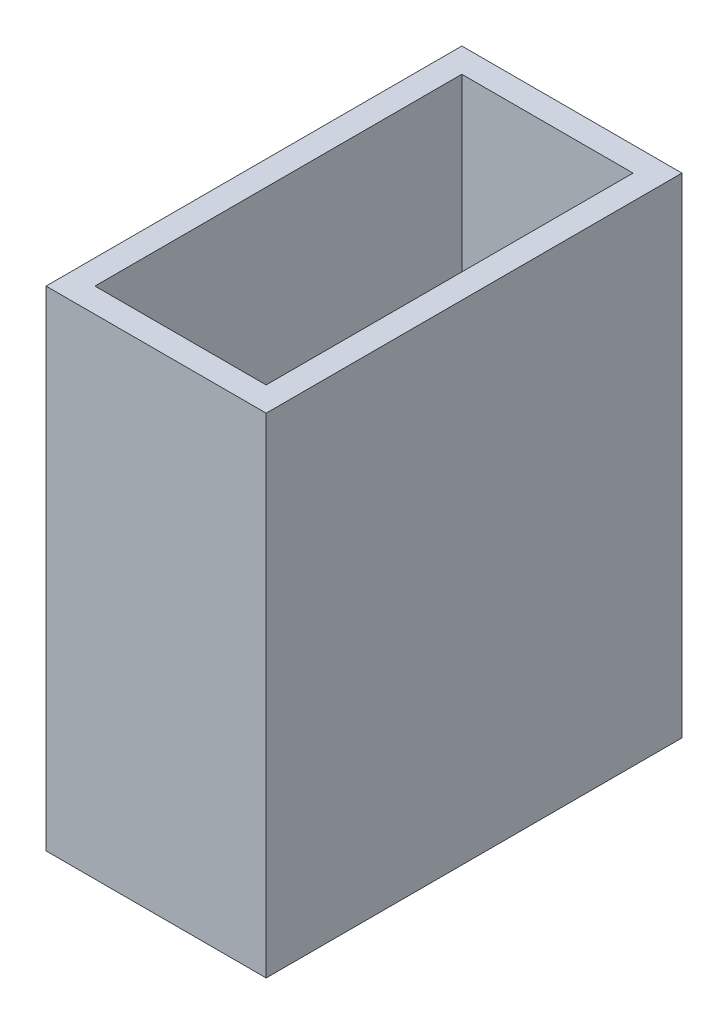
ISO-10303-21;
HEADER;
FILE_DESCRIPTION(('STEP AP214'),'2;1');
FILE_NAME('part.step','',(''),(''),'','','');
FILE_SCHEMA(('AUTOMOTIVE_DESIGN { 1 0 10303 214 1 1 1 1 }'));
ENDSEC;
DATA;
#1=APPLICATION_CONTEXT('core data for automotive mechanical design processes');
#2=APPLICATION_PROTOCOL_DEFINITION('international standard','automotive_design',2000,#1);
#3=PRODUCT_CONTEXT('',#1,'mechanical');
#4=PRODUCT('Part','Part','',(#3));
#5=PRODUCT_RELATED_PRODUCT_CATEGORY('part','',(#4));
#6=PRODUCT_DEFINITION_FORMATION('','',#4);
#7=PRODUCT_DEFINITION_CONTEXT('part definition',#1,'design');
#8=PRODUCT_DEFINITION('design','',#6,#7);
#9=PRODUCT_DEFINITION_SHAPE('','',#8);
#10=(LENGTH_UNIT() NAMED_UNIT(*) SI_UNIT(.MILLI.,.METRE.));
#11=(NAMED_UNIT(*) PLANE_ANGLE_UNIT() SI_UNIT($,.RADIAN.));
#12=(NAMED_UNIT(*) SI_UNIT($,.STERADIAN.) SOLID_ANGLE_UNIT());
#13=UNCERTAINTY_MEASURE_WITH_UNIT(LENGTH_MEASURE(1.E-05),#10,'distance_accuracy_value','');
#14=(GEOMETRIC_REPRESENTATION_CONTEXT(3) GLOBAL_UNCERTAINTY_ASSIGNED_CONTEXT((#13)) GLOBAL_UNIT_ASSIGNED_CONTEXT((#10,
#11,#12)) REPRESENTATION_CONTEXT('',''));
#15=CARTESIAN_POINT('',(0.,0.,0.));
#16=DIRECTION('',(0.,0.,1.));
#17=DIRECTION('',(1.,0.,0.));
#18=AXIS2_PLACEMENT_3D('',#15,#16,#17);
#19=CARTESIAN_POINT('',(0.,20.,0.));
#20=DIRECTION('',(0.,-1.,0.));
#21=DIRECTION('',(0.,0.,-1.));
#22=AXIS2_PLACEMENT_3D('',#19,#20,#21);
#23=CYLINDRICAL_SURFACE('',#22,13.25);
#24=DIRECTION('',(0.,-1.,0.));
#25=VECTOR('',#24,1.);
#26=CARTESIAN_POINT('',(3.4293523476084,20.,-12.7985171983302));
#27=LINE('',#26,#25);
#28=CARTESIAN_POINT('',(3.4293523476084,11.,-12.7985171983302));
#29=VERTEX_POINT('',#28);
#30=CARTESIAN_POINT('',(3.4293523476084,5.,-12.7985171983302));
#31=VERTEX_POINT('',#30);
#32=EDGE_CURVE('E230',#29,#31,#27,.T.);
#33=ORIENTED_EDGE('',*,*,#32,.F.);
#34=CARTESIAN_POINT('',(0.,11.,0.));
#35=DIRECTION('',(0.,1.,0.));
#36=DIRECTION('',(0.,0.,1.));
#37=AXIS2_PLACEMENT_3D('',#34,#35,#36);
#38=CIRCLE('',#37,13.25);
#39=CARTESIAN_POINT('',(-3.42935234760831,11.,-12.7985171983302));
#40=VERTEX_POINT('',#39);
#41=EDGE_CURVE('E220',#29,#40,#38,.T.);
#42=ORIENTED_EDGE('',*,*,#41,.T.);
#43=DIRECTION('',(0.,-1.,0.));
#44=VECTOR('',#43,1.);
#45=CARTESIAN_POINT('',(-3.42935234760831,20.,-12.7985171983302));
#46=LINE('',#45,#44);
#47=CARTESIAN_POINT('',(-3.42935234760831,5.,-12.7985171983302));
#48=VERTEX_POINT('',#47);
#49=EDGE_CURVE('E228',#40,#48,#46,.T.);
#50=ORIENTED_EDGE('',*,*,#49,.T.);
#51=CARTESIAN_POINT('',(0.,5.,0.));
#52=DIRECTION('',(0.,1.,0.));
#53=DIRECTION('',(0.,0.,1.));
#54=AXIS2_PLACEMENT_3D('',#51,#52,#53);
#55=CIRCLE('',#54,13.25);
#56=EDGE_CURVE('E407',#31,#48,#55,.T.);
#57=ORIENTED_EDGE('',*,*,#56,.F.);
#58=EDGE_LOOP('',(#33,#42,#50,#57));
#59=FACE_BOUND('',#58,.T.);
#60=ADVANCED_FACE('F41',(#59),#23,.F.);
#61=CARTESIAN_POINT('',(0.,20.,0.));
#62=DIRECTION('',(-0.965925826289068,0.,-0.258819045102521));
#63=DIRECTION('',(-0.258819045102521,0.,0.965925826289068));
#64=AXIS2_PLACEMENT_3D('',#61,#62,#63);
#65=PLANE('',#64);
#66=DIRECTION('',(0.258819045102521,0.,-0.965925826289068));
#67=VECTOR('',#66,1.);
#68=CARTESIAN_POINT('',(0.,11.,0.));
#69=LINE('',#68,#67);
#70=CARTESIAN_POINT('',(4.20580948291597,11.,-15.6962946771974));
#71=VERTEX_POINT('',#70);
#72=EDGE_CURVE('E233',#29,#71,#69,.T.);
#73=ORIENTED_EDGE('',*,*,#72,.F.);
#74=ORIENTED_EDGE('',*,*,#32,.T.);
#75=DIRECTION('',(0.258819045102521,0.,-0.965925826289068));
#76=VECTOR('',#75,1.);
#77=CARTESIAN_POINT('',(0.,5.,0.));
#78=LINE('',#77,#76);
#79=CARTESIAN_POINT('',(4.20580948291597,5.,-15.6962946771974));
#80=VERTEX_POINT('',#79);
#81=EDGE_CURVE('E480',#31,#80,#78,.T.);
#82=ORIENTED_EDGE('',*,*,#81,.T.);
#83=DIRECTION('',(0.,-1.,0.));
#84=VECTOR('',#83,1.);
#85=CARTESIAN_POINT('',(4.20580948291597,20.,-15.6962946771974));
#86=LINE('',#85,#84);
#87=EDGE_CURVE('E244',#71,#80,#86,.T.);
#88=ORIENTED_EDGE('',*,*,#87,.F.);
#89=EDGE_LOOP('',(#73,#74,#82,#88));
#90=FACE_BOUND('',#89,.T.);
#91=ADVANCED_FACE('F369',(#90),#65,.F.);
#92=CARTESIAN_POINT('',(0.,20.,0.));
#93=DIRECTION('',(0.,-1.,0.));
#94=DIRECTION('',(0.,0.,-1.));
#95=AXIS2_PLACEMENT_3D('',#92,#93,#94);
#96=CYLINDRICAL_SURFACE('',#95,16.25);
#97=CARTESIAN_POINT('',(0.,11.,0.));
#98=DIRECTION('',(0.,1.,0.));
#99=DIRECTION('',(0.,0.,1.));
#100=AXIS2_PLACEMENT_3D('',#97,#98,#99);
#101=CIRCLE('',#100,16.25);
#102=CARTESIAN_POINT('',(-4.20580948291586,11.,-15.6962946771974));
#103=VERTEX_POINT('',#102);
#104=EDGE_CURVE('E56',#71,#103,#101,.T.);
#105=ORIENTED_EDGE('',*,*,#104,.F.);
#106=ORIENTED_EDGE('',*,*,#87,.T.);
#107=CARTESIAN_POINT('',(0.,5.,0.));
#108=DIRECTION('',(0.,1.,0.));
#109=DIRECTION('',(0.,0.,1.));
#110=AXIS2_PLACEMENT_3D('',#107,#108,#109);
#111=CIRCLE('',#110,16.25);
#112=CARTESIAN_POINT('',(-4.20580948291586,5.,-15.6962946771974));
#113=VERTEX_POINT('',#112);
#114=EDGE_CURVE('E246',#80,#113,#111,.T.);
#115=ORIENTED_EDGE('',*,*,#114,.T.);
#116=DIRECTION('',(0.,-1.,0.));
#117=VECTOR('',#116,1.);
#118=CARTESIAN_POINT('',(-4.20580948291586,20.,-15.6962946771974));
#119=LINE('',#118,#117);
#120=EDGE_CURVE('E240',#103,#113,#119,.T.);
#121=ORIENTED_EDGE('',*,*,#120,.F.);
#122=EDGE_LOOP('',(#105,#106,#115,#121));
#123=FACE_BOUND('',#122,.T.);
#124=ADVANCED_FACE('F374',(#123),#96,.T.);
#125=CARTESIAN_POINT('',(0.,20.,0.));
#126=DIRECTION('',(0.96592582628907,0.,-0.258819045102514));
#127=DIRECTION('',(-0.258819045102514,0.,-0.96592582628907));
#128=AXIS2_PLACEMENT_3D('',#125,#126,#127);
#129=PLANE('',#128);
#130=DIRECTION('',(0.258819045102514,0.,0.96592582628907));
#131=VECTOR('',#130,1.);
#132=CARTESIAN_POINT('',(0.,11.,0.));
#133=LINE('',#132,#131);
#134=EDGE_CURVE('E11',#103,#40,#133,.T.);
#135=ORIENTED_EDGE('',*,*,#134,.F.);
#136=ORIENTED_EDGE('',*,*,#120,.T.);
#137=DIRECTION('',(0.258819045102514,0.,0.96592582628907));
#138=VECTOR('',#137,1.);
#139=CARTESIAN_POINT('',(0.,5.,0.));
#140=LINE('',#139,#138);
#141=EDGE_CURVE('E237',#113,#48,#140,.T.);
#142=ORIENTED_EDGE('',*,*,#141,.T.);
#143=ORIENTED_EDGE('',*,*,#49,.F.);
#144=EDGE_LOOP('',(#135,#136,#142,#143));
#145=FACE_BOUND('',#144,.T.);
#146=ADVANCED_FACE('F235',(#145),#129,.F.);
#147=CARTESIAN_POINT('',(0.,20.,29.));
#148=DIRECTION('',(0.,0.,-1.));
#149=DIRECTION('',(-1.,0.,0.));
#150=AXIS2_PLACEMENT_3D('',#147,#148,#149);
#151=PLANE('',#150);
#152=DIRECTION('',(-1.,0.,0.));
#153=VECTOR('',#152,1.);
#154=CARTESIAN_POINT('',(-12.25,17.5,29.));
#155=LINE('',#154,#153);
#156=CARTESIAN_POINT('',(-2.25,17.5,29.));
#157=VERTEX_POINT('',#156);
#158=CARTESIAN_POINT('',(-13.25,17.5,29.));
#159=VERTEX_POINT('',#158);
#160=EDGE_CURVE('E64',#157,#159,#155,.T.);
#161=ORIENTED_EDGE('',*,*,#160,.F.);
#162=DIRECTION('',(0.,-1.,0.));
#163=VECTOR('',#162,1.);
#164=CARTESIAN_POINT('',(-2.25,17.5,29.));
#165=LINE('',#164,#163);
#166=CARTESIAN_POINT('',(-2.25,18.,29.));
#167=VERTEX_POINT('',#166);
#168=EDGE_CURVE('E232',#167,#157,#165,.T.);
#169=ORIENTED_EDGE('',*,*,#168,.F.);
#170=DIRECTION('',(1.,0.,0.));
#171=VECTOR('',#170,1.);
#172=CARTESIAN_POINT('',(-2.25,18.,29.));
#173=LINE('',#172,#171);
#174=CARTESIAN_POINT('',(-1.25,18.,29.));
#175=VERTEX_POINT('',#174);
#176=EDGE_CURVE('E535',#167,#175,#173,.T.);
#177=ORIENTED_EDGE('',*,*,#176,.T.);
#178=DIRECTION('',(0.,-1.,0.));
#179=VECTOR('',#178,1.);
#180=CARTESIAN_POINT('',(-1.25,20.,29.));
#181=LINE('',#180,#179);
#182=CARTESIAN_POINT('',(-1.25,5.,29.));
#183=VERTEX_POINT('',#182);
#184=EDGE_CURVE('E467',#175,#183,#181,.T.);
#185=ORIENTED_EDGE('',*,*,#184,.T.);
#186=DIRECTION('',(1.,0.,0.));
#187=VECTOR('',#186,1.);
#188=CARTESIAN_POINT('',(0.,5.,29.));
#189=LINE('',#188,#187);
#190=CARTESIAN_POINT('',(-13.25,5.,29.));
#191=VERTEX_POINT('',#190);
#192=EDGE_CURVE('E427',#191,#183,#189,.T.);
#193=ORIENTED_EDGE('',*,*,#192,.F.);
#194=DIRECTION('',(0.,-1.,0.));
#195=VECTOR('',#194,1.);
#196=CARTESIAN_POINT('',(-13.25,20.,29.));
#197=LINE('',#196,#195);
#198=EDGE_CURVE('E464',#159,#191,#197,.T.);
#199=ORIENTED_EDGE('',*,*,#198,.F.);
#200=EDGE_LOOP('',(#161,#169,#177,#185,#193,#199));
#201=FACE_BOUND('',#200,.T.);
#202=ADVANCED_FACE('F628',(#201),#151,.T.);
#203=CARTESIAN_POINT('',(-1.25,20.,0.));
#204=DIRECTION('',(-1.,0.,0.));
#205=DIRECTION('',(0.,0.,1.));
#206=AXIS2_PLACEMENT_3D('',#203,#204,#205);
#207=PLANE('',#206);
#208=ORIENTED_EDGE('',*,*,#184,.F.);
#209=DIRECTION('',(0.,0.,1.));
#210=VECTOR('',#209,1.);
#211=CARTESIAN_POINT('',(-1.25,18.,13.1909059582729));
#212=LINE('',#211,#210);
#213=CARTESIAN_POINT('',(-1.25,18.,13.1909059582729));
#214=VERTEX_POINT('',#213);
#215=EDGE_CURVE('E516',#214,#175,#212,.T.);
#216=ORIENTED_EDGE('',*,*,#215,.F.);
#217=DIRECTION('',(0.,-1.,0.));
#218=VECTOR('',#217,1.);
#219=CARTESIAN_POINT('',(-1.25,20.,13.1909059582729));
#220=LINE('',#219,#218);
#221=CARTESIAN_POINT('',(-1.25,5.,13.1909059582729));
#222=VERTEX_POINT('',#221);
#223=EDGE_CURVE('E470',#214,#222,#220,.T.);
#224=ORIENTED_EDGE('',*,*,#223,.T.);
#225=DIRECTION('',(0.,0.,-1.));
#226=VECTOR('',#225,1.);
#227=CARTESIAN_POINT('',(-1.25,5.,0.));
#228=LINE('',#227,#226);
#229=EDGE_CURVE('E420',#183,#222,#228,.T.);
#230=ORIENTED_EDGE('',*,*,#229,.F.);
#231=EDGE_LOOP('',(#208,#216,#224,#230));
#232=FACE_BOUND('',#231,.T.);
#233=ADVANCED_FACE('F402',(#232),#207,.T.);
#234=CARTESIAN_POINT('',(-13.25,20.,0.));
#235=DIRECTION('',(1.,0.,0.));
#236=DIRECTION('',(0.,0.,-1.));
#237=AXIS2_PLACEMENT_3D('',#234,#235,#236);
#238=PLANE('',#237);
#239=DIRECTION('',(0.,1.,0.));
#240=VECTOR('',#239,1.);
#241=CARTESIAN_POINT('',(-13.25,20.,9.));
#242=LINE('',#241,#240);
#243=CARTESIAN_POINT('',(-13.25,17.5,9.));
#244=VERTEX_POINT('',#243);
#245=CARTESIAN_POINT('',(-13.25,20.,9.));
#246=VERTEX_POINT('',#245);
#247=EDGE_CURVE('E547',#244,#246,#242,.T.);
#248=ORIENTED_EDGE('',*,*,#247,.F.);
#249=DIRECTION('',(0.,0.,-1.));
#250=VECTOR('',#249,1.);
#251=CARTESIAN_POINT('',(-13.25,17.5,29.));
#252=LINE('',#251,#250);
#253=EDGE_CURVE('E542',#159,#244,#252,.T.);
#254=ORIENTED_EDGE('',*,*,#253,.F.);
#255=ORIENTED_EDGE('',*,*,#198,.T.);
#256=DIRECTION('',(0.,0.,1.));
#257=VECTOR('',#256,1.);
#258=CARTESIAN_POINT('',(-13.25,5.,0.));
#259=LINE('',#258,#257);
#260=CARTESIAN_POINT('',(-13.25,5.,0.));
#261=VERTEX_POINT('',#260);
#262=EDGE_CURVE('E434',#261,#191,#259,.T.);
#263=ORIENTED_EDGE('',*,*,#262,.F.);
#264=DIRECTION('',(0.,-1.,0.));
#265=VECTOR('',#264,1.);
#266=CARTESIAN_POINT('',(-13.25,20.,0.));
#267=LINE('',#266,#265);
#268=CARTESIAN_POINT('',(-13.25,20.,0.));
#269=VERTEX_POINT('',#268);
#270=EDGE_CURVE('E461',#269,#261,#267,.T.);
#271=ORIENTED_EDGE('',*,*,#270,.F.);
#272=DIRECTION('',(0.,0.,1.));
#273=VECTOR('',#272,1.);
#274=CARTESIAN_POINT('',(-13.25,20.,0.));
#275=LINE('',#274,#273);
#276=EDGE_CURVE('E575',#269,#246,#275,.T.);
#277=ORIENTED_EDGE('',*,*,#276,.T.);
#278=EDGE_LOOP('',(#248,#254,#255,#263,#271,#277));
#279=FACE_BOUND('',#278,.T.);
#280=ADVANCED_FACE('F396',(#279),#238,.T.);
#281=CARTESIAN_POINT('',(0.,5.,0.));
#282=DIRECTION('',(0.,1.,0.));
#283=DIRECTION('',(0.,0.,1.));
#284=AXIS2_PLACEMENT_3D('',#281,#282,#283);
#285=PLANE('',#284);
#286=ORIENTED_EDGE('',*,*,#56,.T.);
#287=ORIENTED_EDGE('',*,*,#141,.F.);
#288=ORIENTED_EDGE('',*,*,#114,.F.);
#289=ORIENTED_EDGE('',*,*,#81,.F.);
#290=EDGE_LOOP('',(#286,#287,#288,#289));
#291=FACE_BOUND('',#290,.T.);
#292=DIRECTION('',(0.,0.,-1.));
#293=VECTOR('',#292,1.);
#294=CARTESIAN_POINT('',(17.5,5.,-42.5));
#295=LINE('',#294,#293);
#296=CARTESIAN_POINT('',(17.5,5.,37.5));
#297=VERTEX_POINT('',#296);
#298=CARTESIAN_POINT('',(17.5,5.,-37.5));
#299=VERTEX_POINT('',#298);
#300=EDGE_CURVE('E254',#297,#299,#295,.T.);
#301=ORIENTED_EDGE('',*,*,#300,.T.);
#302=DIRECTION('',(-1.,0.,0.));
#303=VECTOR('',#302,1.);
#304=CARTESIAN_POINT('',(-22.5,5.,-37.5));
#305=LINE('',#304,#303);
#306=CARTESIAN_POINT('',(-17.5,5.,-37.5));
#307=VERTEX_POINT('',#306);
#308=EDGE_CURVE('E258',#299,#307,#305,.T.);
#309=ORIENTED_EDGE('',*,*,#308,.T.);
#310=DIRECTION('',(0.,0.,1.));
#311=VECTOR('',#310,1.);
#312=CARTESIAN_POINT('',(-17.5,5.,-42.5));
#313=LINE('',#312,#311);
#314=CARTESIAN_POINT('',(-17.5,5.,37.5));
#315=VERTEX_POINT('',#314);
#316=EDGE_CURVE('E273',#307,#315,#313,.T.);
#317=ORIENTED_EDGE('',*,*,#316,.T.);
#318=DIRECTION('',(1.,0.,0.));
#319=VECTOR('',#318,1.);
#320=CARTESIAN_POINT('',(-22.5,5.,37.5));
#321=LINE('',#320,#319);
#322=EDGE_CURVE('E279',#315,#297,#321,.T.);
#323=ORIENTED_EDGE('',*,*,#322,.T.);
#324=EDGE_LOOP('',(#301,#309,#317,#323));
#325=FACE_BOUND('',#324,.T.);
#326=CARTESIAN_POINT('',(0.,5.,0.));
#327=DIRECTION('',(0.,1.,0.));
#328=DIRECTION('',(0.,0.,1.));
#329=AXIS2_PLACEMENT_3D('',#326,#327,#328);
#330=CIRCLE('',#329,13.25);
#331=CARTESIAN_POINT('',(1.75,5.,13.1339255365637));
#332=VERTEX_POINT('',#331);
#333=EDGE_CURVE('E414',#222,#332,#330,.T.);
#334=ORIENTED_EDGE('',*,*,#333,.T.);
#335=DIRECTION('',(0.,0.,-1.));
#336=VECTOR('',#335,1.);
#337=CARTESIAN_POINT('',(1.75,5.,0.));
#338=LINE('',#337,#336);
#339=CARTESIAN_POINT('',(1.75,5.,32.));
#340=VERTEX_POINT('',#339);
#341=EDGE_CURVE('E417',#340,#332,#338,.T.);
#342=ORIENTED_EDGE('',*,*,#341,.F.);
#343=DIRECTION('',(1.,0.,0.));
#344=VECTOR('',#343,1.);
#345=CARTESIAN_POINT('',(0.,5.,32.));
#346=LINE('',#345,#344);
#347=CARTESIAN_POINT('',(-16.25,5.,32.));
#348=VERTEX_POINT('',#347);
#349=EDGE_CURVE('E445',#348,#340,#346,.T.);
#350=ORIENTED_EDGE('',*,*,#349,.F.);
#351=DIRECTION('',(0.,0.,1.));
#352=VECTOR('',#351,1.);
#353=CARTESIAN_POINT('',(-16.25,5.,0.));
#354=LINE('',#353,#352);
#355=CARTESIAN_POINT('',(-16.25,5.,0.));
#356=VERTEX_POINT('',#355);
#357=EDGE_CURVE('E441',#356,#348,#354,.T.);
#358=ORIENTED_EDGE('',*,*,#357,.F.);
#359=DIRECTION('',(-1.,0.,0.));
#360=VECTOR('',#359,1.);
#361=CARTESIAN_POINT('',(0.,5.,0.));
#362=LINE('',#361,#360);
#363=EDGE_CURVE('E438',#261,#356,#362,.T.);
#364=ORIENTED_EDGE('',*,*,#363,.F.);
#365=ORIENTED_EDGE('',*,*,#262,.T.);
#366=ORIENTED_EDGE('',*,*,#192,.T.);
#367=ORIENTED_EDGE('',*,*,#229,.T.);
#368=EDGE_LOOP('',(#334,#342,#350,#358,#364,#365,#366,#367));
#369=FACE_BOUND('',#368,.T.);
#370=ADVANCED_FACE('F394',(#291,#325,#369),#285,.T.);
#371=CARTESIAN_POINT('',(22.5,100.,-42.5));
#372=DIRECTION('',(-1.,0.,0.));
#373=DIRECTION('',(0.,0.,1.));
#374=AXIS2_PLACEMENT_3D('',#371,#372,#373);
#375=PLANE('',#374);
#376=DIRECTION('',(0.,0.,-1.));
#377=VECTOR('',#376,1.);
#378=CARTESIAN_POINT('',(22.5,0.,-42.5));
#379=LINE('',#378,#377);
#380=CARTESIAN_POINT('',(22.5,0.,42.5));
#381=VERTEX_POINT('',#380);
#382=CARTESIAN_POINT('',(22.5,0.,-42.5));
#383=VERTEX_POINT('',#382);
#384=EDGE_CURVE('E263',#381,#383,#379,.T.);
#385=ORIENTED_EDGE('',*,*,#384,.T.);
#386=DIRECTION('',(0.,-1.,0.));
#387=VECTOR('',#386,1.);
#388=CARTESIAN_POINT('',(22.5,100.,-42.5));
#389=LINE('',#388,#387);
#390=CARTESIAN_POINT('',(22.5,100.,-42.5));
#391=VERTEX_POINT('',#390);
#392=EDGE_CURVE('E50',#391,#383,#389,.T.);
#393=ORIENTED_EDGE('',*,*,#392,.F.);
#394=DIRECTION('',(0.,0.,-1.));
#395=VECTOR('',#394,1.);
#396=CARTESIAN_POINT('',(22.5,100.,-42.5));
#397=LINE('',#396,#395);
#398=CARTESIAN_POINT('',(22.5,100.,42.5));
#399=VERTEX_POINT('',#398);
#400=EDGE_CURVE('E297',#399,#391,#397,.T.);
#401=ORIENTED_EDGE('',*,*,#400,.F.);
#402=DIRECTION('',(0.,-1.,0.));
#403=VECTOR('',#402,1.);
#404=CARTESIAN_POINT('',(22.5,100.,42.5));
#405=LINE('',#404,#403);
#406=EDGE_CURVE('E311',#399,#381,#405,.T.);
#407=ORIENTED_EDGE('',*,*,#406,.T.);
#408=EDGE_LOOP('',(#385,#393,#401,#407));
#409=FACE_BOUND('',#408,.T.);
#410=ADVANCED_FACE('F43',(#409),#375,.F.);
#411=CARTESIAN_POINT('',(-22.5,100.,-42.5));
#412=DIRECTION('',(0.,0.,1.));
#413=DIRECTION('',(1.,0.,0.));
#414=AXIS2_PLACEMENT_3D('',#411,#412,#413);
#415=PLANE('',#414);
#416=DIRECTION('',(-1.,0.,0.));
#417=VECTOR('',#416,1.);
#418=CARTESIAN_POINT('',(-22.5,0.,-42.5));
#419=LINE('',#418,#417);
#420=CARTESIAN_POINT('',(-22.5,0.,-42.5));
#421=VERTEX_POINT('',#420);
#422=EDGE_CURVE('E315',#383,#421,#419,.T.);
#423=ORIENTED_EDGE('',*,*,#422,.T.);
#424=DIRECTION('',(0.,-1.,0.));
#425=VECTOR('',#424,1.);
#426=CARTESIAN_POINT('',(-22.5,100.,-42.5));
#427=LINE('',#426,#425);
#428=CARTESIAN_POINT('',(-22.5,100.,-42.5));
#429=VERTEX_POINT('',#428);
#430=EDGE_CURVE('E330',#429,#421,#427,.T.);
#431=ORIENTED_EDGE('',*,*,#430,.F.);
#432=DIRECTION('',(-1.,0.,0.));
#433=VECTOR('',#432,1.);
#434=CARTESIAN_POINT('',(-22.5,100.,-42.5));
#435=LINE('',#434,#433);
#436=EDGE_CURVE('E301',#391,#429,#435,.T.);
#437=ORIENTED_EDGE('',*,*,#436,.F.);
#438=ORIENTED_EDGE('',*,*,#392,.T.);
#439=EDGE_LOOP('',(#423,#431,#437,#438));
#440=FACE_BOUND('',#439,.T.);
#441=ADVANCED_FACE('F337',(#440),#415,.F.);
#442=CARTESIAN_POINT('',(-22.5,100.,-42.5));
#443=DIRECTION('',(1.,0.,0.));
#444=DIRECTION('',(0.,0.,-1.));
#445=AXIS2_PLACEMENT_3D('',#442,#443,#444);
#446=PLANE('',#445);
#447=DIRECTION('',(0.,0.,1.));
#448=VECTOR('',#447,1.);
#449=CARTESIAN_POINT('',(-22.5,0.,-42.5));
#450=LINE('',#449,#448);
#451=CARTESIAN_POINT('',(-22.5,0.,42.5));
#452=VERTEX_POINT('',#451);
#453=EDGE_CURVE('E318',#421,#452,#450,.T.);
#454=ORIENTED_EDGE('',*,*,#453,.T.);
#455=DIRECTION('',(0.,-1.,0.));
#456=VECTOR('',#455,1.);
#457=CARTESIAN_POINT('',(-22.5,100.,42.5));
#458=LINE('',#457,#456);
#459=CARTESIAN_POINT('',(-22.5,100.,42.5));
#460=VERTEX_POINT('',#459);
#461=EDGE_CURVE('E326',#460,#452,#458,.T.);
#462=ORIENTED_EDGE('',*,*,#461,.F.);
#463=DIRECTION('',(0.,0.,1.));
#464=VECTOR('',#463,1.);
#465=CARTESIAN_POINT('',(-22.5,100.,-42.5));
#466=LINE('',#465,#464);
#467=EDGE_CURVE('E305',#429,#460,#466,.T.);
#468=ORIENTED_EDGE('',*,*,#467,.F.);
#469=ORIENTED_EDGE('',*,*,#430,.T.);
#470=EDGE_LOOP('',(#454,#462,#468,#469));
#471=FACE_BOUND('',#470,.T.);
#472=ADVANCED_FACE('F349',(#471),#446,.F.);
#473=CARTESIAN_POINT('',(-22.5,100.,42.5));
#474=DIRECTION('',(0.,0.,-1.));
#475=DIRECTION('',(-1.,0.,0.));
#476=AXIS2_PLACEMENT_3D('',#473,#474,#475);
#477=PLANE('',#476);
#478=DIRECTION('',(1.,0.,0.));
#479=VECTOR('',#478,1.);
#480=CARTESIAN_POINT('',(-22.5,0.,42.5));
#481=LINE('',#480,#479);
#482=EDGE_CURVE('E302',#452,#381,#481,.T.);
#483=ORIENTED_EDGE('',*,*,#482,.T.);
#484=ORIENTED_EDGE('',*,*,#406,.F.);
#485=DIRECTION('',(1.,0.,0.));
#486=VECTOR('',#485,1.);
#487=CARTESIAN_POINT('',(-22.5,100.,42.5));
#488=LINE('',#487,#486);
#489=EDGE_CURVE('E308',#460,#399,#488,.T.);
#490=ORIENTED_EDGE('',*,*,#489,.F.);
#491=ORIENTED_EDGE('',*,*,#461,.T.);
#492=EDGE_LOOP('',(#483,#484,#490,#491));
#493=FACE_BOUND('',#492,.T.);
#494=ADVANCED_FACE('F353',(#493),#477,.F.);
#495=CARTESIAN_POINT('',(0.,100.,0.));
#496=DIRECTION('',(0.,1.,0.));
#497=DIRECTION('',(0.,0.,1.));
#498=AXIS2_PLACEMENT_3D('',#495,#496,#497);
#499=PLANE('',#498);
#500=DIRECTION('',(0.,0.,-1.));
#501=VECTOR('',#500,1.);
#502=CARTESIAN_POINT('',(17.5,100.,-42.5));
#503=LINE('',#502,#501);
#504=CARTESIAN_POINT('',(17.5,100.,37.5));
#505=VERTEX_POINT('',#504);
#506=CARTESIAN_POINT('',(17.5,100.,-37.5));
#507=VERTEX_POINT('',#506);
#508=EDGE_CURVE('E285',#505,#507,#503,.T.);
#509=ORIENTED_EDGE('',*,*,#508,.F.);
#510=DIRECTION('',(1.,0.,0.));
#511=VECTOR('',#510,1.);
#512=CARTESIAN_POINT('',(-22.5,100.,37.5));
#513=LINE('',#512,#511);
#514=CARTESIAN_POINT('',(-17.5,100.,37.5));
#515=VERTEX_POINT('',#514);
#516=EDGE_CURVE('E270',#515,#505,#513,.T.);
#517=ORIENTED_EDGE('',*,*,#516,.F.);
#518=DIRECTION('',(0.,0.,1.));
#519=VECTOR('',#518,1.);
#520=CARTESIAN_POINT('',(-17.5,100.,-42.5));
#521=LINE('',#520,#519);
#522=CARTESIAN_POINT('',(-17.5,100.,-37.5));
#523=VERTEX_POINT('',#522);
#524=EDGE_CURVE('E291',#523,#515,#521,.T.);
#525=ORIENTED_EDGE('',*,*,#524,.F.);
#526=DIRECTION('',(-1.,0.,0.));
#527=VECTOR('',#526,1.);
#528=CARTESIAN_POINT('',(-22.5,100.,-37.5));
#529=LINE('',#528,#527);
#530=EDGE_CURVE('E288',#507,#523,#529,.T.);
#531=ORIENTED_EDGE('',*,*,#530,.F.);
#532=EDGE_LOOP('',(#509,#517,#525,#531));
#533=FACE_BOUND('',#532,.T.);
#534=ORIENTED_EDGE('',*,*,#400,.T.);
#535=ORIENTED_EDGE('',*,*,#436,.T.);
#536=ORIENTED_EDGE('',*,*,#467,.T.);
#537=ORIENTED_EDGE('',*,*,#489,.T.);
#538=EDGE_LOOP('',(#534,#535,#536,#537));
#539=FACE_BOUND('',#538,.T.);
#540=ADVANCED_FACE('F355',(#533,#539),#499,.T.);
#541=CARTESIAN_POINT('',(0.,0.,0.));
#542=DIRECTION('',(0.,1.,0.));
#543=DIRECTION('',(0.,0.,1.));
#544=AXIS2_PLACEMENT_3D('',#541,#542,#543);
#545=PLANE('',#544);
#546=ORIENTED_EDGE('',*,*,#384,.F.);
#547=ORIENTED_EDGE('',*,*,#482,.F.);
#548=ORIENTED_EDGE('',*,*,#453,.F.);
#549=ORIENTED_EDGE('',*,*,#422,.F.);
#550=EDGE_LOOP('',(#546,#547,#548,#549));
#551=FACE_BOUND('',#550,.T.);
#552=ADVANCED_FACE('F345',(#551),#545,.F.);
#553=CARTESIAN_POINT('',(17.5,100.,-42.5));
#554=DIRECTION('',(-1.,0.,0.));
#555=DIRECTION('',(0.,0.,1.));
#556=AXIS2_PLACEMENT_3D('',#553,#554,#555);
#557=PLANE('',#556);
#558=ORIENTED_EDGE('',*,*,#300,.F.);
#559=DIRECTION('',(0.,-1.,0.));
#560=VECTOR('',#559,1.);
#561=CARTESIAN_POINT('',(17.5,100.,37.5));
#562=LINE('',#561,#560);
#563=EDGE_CURVE('E265',#505,#297,#562,.T.);
#564=ORIENTED_EDGE('',*,*,#563,.F.);
#565=ORIENTED_EDGE('',*,*,#508,.T.);
#566=DIRECTION('',(0.,-1.,0.));
#567=VECTOR('',#566,1.);
#568=CARTESIAN_POINT('',(17.5,100.,-37.5));
#569=LINE('',#568,#567);
#570=EDGE_CURVE('E259',#507,#299,#569,.T.);
#571=ORIENTED_EDGE('',*,*,#570,.T.);
#572=EDGE_LOOP('',(#558,#564,#565,#571));
#573=FACE_BOUND('',#572,.T.);
#574=ADVANCED_FACE('F363',(#573),#557,.T.);
#575=CARTESIAN_POINT('',(-22.5,100.,-37.5));
#576=DIRECTION('',(0.,0.,1.));
#577=DIRECTION('',(1.,0.,0.));
#578=AXIS2_PLACEMENT_3D('',#575,#576,#577);
#579=PLANE('',#578);
#580=ORIENTED_EDGE('',*,*,#308,.F.);
#581=ORIENTED_EDGE('',*,*,#570,.F.);
#582=ORIENTED_EDGE('',*,*,#530,.T.);
#583=DIRECTION('',(0.,-1.,0.));
#584=VECTOR('',#583,1.);
#585=CARTESIAN_POINT('',(-17.5,100.,-37.5));
#586=LINE('',#585,#584);
#587=EDGE_CURVE('E264',#523,#307,#586,.T.);
#588=ORIENTED_EDGE('',*,*,#587,.T.);
#589=EDGE_LOOP('',(#580,#581,#582,#588));
#590=FACE_BOUND('',#589,.T.);
#591=ADVANCED_FACE('F381',(#590),#579,.T.);
#592=CARTESIAN_POINT('',(-17.5,100.,-42.5));
#593=DIRECTION('',(1.,0.,0.));
#594=DIRECTION('',(0.,0.,-1.));
#595=AXIS2_PLACEMENT_3D('',#592,#593,#594);
#596=PLANE('',#595);
#597=ORIENTED_EDGE('',*,*,#316,.F.);
#598=ORIENTED_EDGE('',*,*,#587,.F.);
#599=ORIENTED_EDGE('',*,*,#524,.T.);
#600=DIRECTION('',(0.,-1.,0.));
#601=VECTOR('',#600,1.);
#602=CARTESIAN_POINT('',(-17.5,100.,37.5));
#603=LINE('',#602,#601);
#604=EDGE_CURVE('E269',#515,#315,#603,.T.);
#605=ORIENTED_EDGE('',*,*,#604,.T.);
#606=EDGE_LOOP('',(#597,#598,#599,#605));
#607=FACE_BOUND('',#606,.T.);
#608=ADVANCED_FACE('F385',(#607),#596,.T.);
#609=CARTESIAN_POINT('',(-22.5,100.,37.5));
#610=DIRECTION('',(0.,0.,-1.));
#611=DIRECTION('',(-1.,0.,0.));
#612=AXIS2_PLACEMENT_3D('',#609,#610,#611);
#613=PLANE('',#612);
#614=ORIENTED_EDGE('',*,*,#322,.F.);
#615=ORIENTED_EDGE('',*,*,#604,.F.);
#616=ORIENTED_EDGE('',*,*,#516,.T.);
#617=ORIENTED_EDGE('',*,*,#563,.T.);
#618=EDGE_LOOP('',(#614,#615,#616,#617));
#619=FACE_BOUND('',#618,.T.);
#620=ADVANCED_FACE('F389',(#619),#613,.T.);
#621=CARTESIAN_POINT('',(1.75,20.,0.));
#622=DIRECTION('',(-1.,0.,0.));
#623=DIRECTION('',(0.,0.,1.));
#624=AXIS2_PLACEMENT_3D('',#621,#622,#623);
#625=PLANE('',#624);
#626=ORIENTED_EDGE('',*,*,#341,.T.);
#627=DIRECTION('',(0.,-1.,0.));
#628=VECTOR('',#627,1.);
#629=CARTESIAN_POINT('',(1.75,20.,13.1339255365637));
#630=LINE('',#629,#628);
#631=CARTESIAN_POINT('',(1.75,20.,13.1339255365637));
#632=VERTEX_POINT('',#631);
#633=EDGE_CURVE('E475',#632,#332,#630,.T.);
#634=ORIENTED_EDGE('',*,*,#633,.F.);
#635=DIRECTION('',(0.,0.,-1.));
#636=VECTOR('',#635,1.);
#637=CARTESIAN_POINT('',(1.75,20.,0.));
#638=LINE('',#637,#636);
#639=CARTESIAN_POINT('',(1.75,20.,32.));
#640=VERTEX_POINT('',#639);
#641=EDGE_CURVE('E448',#640,#632,#638,.T.);
#642=ORIENTED_EDGE('',*,*,#641,.F.);
#643=DIRECTION('',(0.,-1.,0.));
#644=VECTOR('',#643,1.);
#645=CARTESIAN_POINT('',(1.75,20.,32.));
#646=LINE('',#645,#644);
#647=EDGE_CURVE('E449',#640,#340,#646,.T.);
#648=ORIENTED_EDGE('',*,*,#647,.T.);
#649=EDGE_LOOP('',(#626,#634,#642,#648));
#650=FACE_BOUND('',#649,.T.);
#651=ADVANCED_FACE('F392',(#650),#625,.F.);
#652=CARTESIAN_POINT('',(0.,20.,0.));
#653=DIRECTION('',(0.,-1.,0.));
#654=DIRECTION('',(0.,0.,-1.));
#655=AXIS2_PLACEMENT_3D('',#652,#653,#654);
#656=CYLINDRICAL_SURFACE('',#655,13.25);
#657=ORIENTED_EDGE('',*,*,#333,.F.);
#658=ORIENTED_EDGE('',*,*,#223,.F.);
#659=CARTESIAN_POINT('',(-1.25,20.,13.1909059582729));
#660=VERTEX_POINT('',#659);
#661=EDGE_CURVE('E471',#660,#214,#220,.T.);
#662=ORIENTED_EDGE('',*,*,#661,.F.);
#663=CARTESIAN_POINT('',(0.,20.,0.));
#664=DIRECTION('',(0.,1.,0.));
#665=DIRECTION('',(0.,0.,1.));
#666=AXIS2_PLACEMENT_3D('',#663,#664,#665);
#667=CIRCLE('',#666,13.25);
#668=EDGE_CURVE('E571',#660,#632,#667,.T.);
#669=ORIENTED_EDGE('',*,*,#668,.T.);
#670=ORIENTED_EDGE('',*,*,#633,.T.);
#671=EDGE_LOOP('',(#657,#658,#662,#669,#670));
#672=FACE_BOUND('',#671,.T.);
#673=ADVANCED_FACE('F597',(#672),#656,.F.);
#674=CARTESIAN_POINT('',(0.,20.,0.));
#675=DIRECTION('',(0.,0.,1.));
#676=DIRECTION('',(1.,0.,0.));
#677=AXIS2_PLACEMENT_3D('',#674,#675,#676);
#678=PLANE('',#677);
#679=ORIENTED_EDGE('',*,*,#363,.T.);
#680=DIRECTION('',(0.,-1.,0.));
#681=VECTOR('',#680,1.);
#682=CARTESIAN_POINT('',(-16.25,20.,0.));
#683=LINE('',#682,#681);
#684=CARTESIAN_POINT('',(-16.25,20.,0.));
#685=VERTEX_POINT('',#684);
#686=EDGE_CURVE('E457',#685,#356,#683,.T.);
#687=ORIENTED_EDGE('',*,*,#686,.F.);
#688=DIRECTION('',(-1.,0.,0.));
#689=VECTOR('',#688,1.);
#690=CARTESIAN_POINT('',(0.,20.,0.));
#691=LINE('',#690,#689);
#692=EDGE_CURVE('E578',#269,#685,#691,.T.);
#693=ORIENTED_EDGE('',*,*,#692,.F.);
#694=ORIENTED_EDGE('',*,*,#270,.T.);
#695=EDGE_LOOP('',(#679,#687,#693,#694));
#696=FACE_BOUND('',#695,.T.);
#697=ADVANCED_FACE('F641',(#696),#678,.F.);
#698=CARTESIAN_POINT('',(-16.25,20.,0.));
#699=DIRECTION('',(1.,0.,0.));
#700=DIRECTION('',(0.,0.,-1.));
#701=AXIS2_PLACEMENT_3D('',#698,#699,#700);
#702=PLANE('',#701);
#703=ORIENTED_EDGE('',*,*,#357,.T.);
#704=DIRECTION('',(0.,-1.,0.));
#705=VECTOR('',#704,1.);
#706=CARTESIAN_POINT('',(-16.25,20.,32.));
#707=LINE('',#706,#705);
#708=CARTESIAN_POINT('',(-16.25,20.,32.));
#709=VERTEX_POINT('',#708);
#710=EDGE_CURVE('E453',#709,#348,#707,.T.);
#711=ORIENTED_EDGE('',*,*,#710,.F.);
#712=DIRECTION('',(0.,0.,1.));
#713=VECTOR('',#712,1.);
#714=CARTESIAN_POINT('',(-16.25,20.,0.));
#715=LINE('',#714,#713);
#716=EDGE_CURVE('E581',#685,#709,#715,.T.);
#717=ORIENTED_EDGE('',*,*,#716,.F.);
#718=ORIENTED_EDGE('',*,*,#686,.T.);
#719=EDGE_LOOP('',(#703,#711,#717,#718));
#720=FACE_BOUND('',#719,.T.);
#721=ADVANCED_FACE('F643',(#720),#702,.F.);
#722=CARTESIAN_POINT('',(0.,20.,32.));
#723=DIRECTION('',(0.,0.,-1.));
#724=DIRECTION('',(-1.,0.,0.));
#725=AXIS2_PLACEMENT_3D('',#722,#723,#724);
#726=PLANE('',#725);
#727=ORIENTED_EDGE('',*,*,#349,.T.);
#728=ORIENTED_EDGE('',*,*,#647,.F.);
#729=DIRECTION('',(1.,0.,0.));
#730=VECTOR('',#729,1.);
#731=CARTESIAN_POINT('',(0.,20.,32.));
#732=LINE('',#731,#730);
#733=EDGE_CURVE('E454',#709,#640,#732,.T.);
#734=ORIENTED_EDGE('',*,*,#733,.F.);
#735=ORIENTED_EDGE('',*,*,#710,.T.);
#736=EDGE_LOOP('',(#727,#728,#734,#735));
#737=FACE_BOUND('',#736,.T.);
#738=ADVANCED_FACE('F594',(#737),#726,.F.);
#739=CARTESIAN_POINT('',(0.,20.,0.));
#740=DIRECTION('',(0.,1.,0.));
#741=DIRECTION('',(0.,0.,1.));
#742=AXIS2_PLACEMENT_3D('',#739,#740,#741);
#743=PLANE('',#742);
#744=DIRECTION('',(1.,0.,0.));
#745=VECTOR('',#744,1.);
#746=CARTESIAN_POINT('',(-12.25,20.,28.));
#747=LINE('',#746,#745);
#748=CARTESIAN_POINT('',(-12.25,20.,28.));
#749=VERTEX_POINT('',#748);
#750=CARTESIAN_POINT('',(-2.25,20.,28.));
#751=VERTEX_POINT('',#750);
#752=EDGE_CURVE('E497',#749,#751,#747,.T.);
#753=ORIENTED_EDGE('',*,*,#752,.F.);
#754=DIRECTION('',(0.,0.,1.));
#755=VECTOR('',#754,1.);
#756=CARTESIAN_POINT('',(-12.25,20.,29.));
#757=LINE('',#756,#755);
#758=CARTESIAN_POINT('',(-12.25,20.,9.));
#759=VERTEX_POINT('',#758);
#760=EDGE_CURVE('E550',#759,#749,#757,.T.);
#761=ORIENTED_EDGE('',*,*,#760,.F.);
#762=DIRECTION('',(-1.,0.,0.));
#763=VECTOR('',#762,1.);
#764=CARTESIAN_POINT('',(-12.25,20.,9.));
#765=LINE('',#764,#763);
#766=EDGE_CURVE('E553',#759,#246,#765,.T.);
#767=ORIENTED_EDGE('',*,*,#766,.T.);
#768=ORIENTED_EDGE('',*,*,#276,.F.);
#769=ORIENTED_EDGE('',*,*,#692,.T.);
#770=ORIENTED_EDGE('',*,*,#716,.T.);
#771=ORIENTED_EDGE('',*,*,#733,.T.);
#772=ORIENTED_EDGE('',*,*,#641,.T.);
#773=ORIENTED_EDGE('',*,*,#668,.F.);
#774=DIRECTION('',(1.,0.,0.));
#775=VECTOR('',#774,1.);
#776=CARTESIAN_POINT('',(-2.25,20.,13.1909059582729));
#777=LINE('',#776,#775);
#778=CARTESIAN_POINT('',(-2.25,20.,13.1909059582729));
#779=VERTEX_POINT('',#778);
#780=EDGE_CURVE('E528',#779,#660,#777,.T.);
#781=ORIENTED_EDGE('',*,*,#780,.F.);
#782=DIRECTION('',(0.,0.,-1.));
#783=VECTOR('',#782,1.);
#784=CARTESIAN_POINT('',(-2.25,20.,13.1909059582729));
#785=LINE('',#784,#783);
#786=EDGE_CURVE('E525',#751,#779,#785,.T.);
#787=ORIENTED_EDGE('',*,*,#786,.F.);
#788=EDGE_LOOP('',(#753,#761,#767,#768,#769,#770,#771,#772,#773,#781,#787));
#789=FACE_BOUND('',#788,.T.);
#790=ADVANCED_FACE('F588',(#789),#743,.T.);
#791=CARTESIAN_POINT('',(-12.25,17.5,29.));
#792=DIRECTION('',(0.,1.,0.));
#793=DIRECTION('',(0.,0.,1.));
#794=AXIS2_PLACEMENT_3D('',#791,#792,#793);
#795=PLANE('',#794);
#796=ORIENTED_EDGE('',*,*,#253,.T.);
#797=DIRECTION('',(-1.,0.,0.));
#798=VECTOR('',#797,1.);
#799=CARTESIAN_POINT('',(-12.25,17.5,9.));
#800=LINE('',#799,#798);
#801=CARTESIAN_POINT('',(-12.25,17.5,9.));
#802=VERTEX_POINT('',#801);
#803=EDGE_CURVE('E563',#802,#244,#800,.T.);
#804=ORIENTED_EDGE('',*,*,#803,.F.);
#805=DIRECTION('',(0.,0.,-1.));
#806=VECTOR('',#805,1.);
#807=CARTESIAN_POINT('',(-12.25,17.5,29.));
#808=LINE('',#807,#806);
#809=CARTESIAN_POINT('',(-12.25,17.5,28.));
#810=VERTEX_POINT('',#809);
#811=EDGE_CURVE('E543',#810,#802,#808,.T.);
#812=ORIENTED_EDGE('',*,*,#811,.F.);
#813=DIRECTION('',(-1.,0.,0.));
#814=VECTOR('',#813,1.);
#815=CARTESIAN_POINT('',(-12.25,17.5,28.));
#816=LINE('',#815,#814);
#817=CARTESIAN_POINT('',(-2.25,17.5,28.));
#818=VERTEX_POINT('',#817);
#819=EDGE_CURVE('E506',#818,#810,#816,.T.);
#820=ORIENTED_EDGE('',*,*,#819,.F.);
#821=DIRECTION('',(0.,0.,1.));
#822=VECTOR('',#821,1.);
#823=CARTESIAN_POINT('',(-2.25,17.5,28.));
#824=LINE('',#823,#822);
#825=EDGE_CURVE('E510',#818,#157,#824,.T.);
#826=ORIENTED_EDGE('',*,*,#825,.T.);
#827=ORIENTED_EDGE('',*,*,#160,.T.);
#828=EDGE_LOOP('',(#796,#804,#812,#820,#826,#827));
#829=FACE_BOUND('',#828,.T.);
#830=ADVANCED_FACE('F622',(#829),#795,.F.);
#831=CARTESIAN_POINT('',(-12.25,20.,9.));
#832=DIRECTION('',(0.,0.,1.));
#833=DIRECTION('',(1.,0.,0.));
#834=AXIS2_PLACEMENT_3D('',#831,#832,#833);
#835=PLANE('',#834);
#836=ORIENTED_EDGE('',*,*,#247,.T.);
#837=ORIENTED_EDGE('',*,*,#766,.F.);
#838=DIRECTION('',(0.,1.,0.));
#839=VECTOR('',#838,1.);
#840=CARTESIAN_POINT('',(-12.25,20.,9.));
#841=LINE('',#840,#839);
#842=EDGE_CURVE('E546',#802,#759,#841,.T.);
#843=ORIENTED_EDGE('',*,*,#842,.F.);
#844=ORIENTED_EDGE('',*,*,#803,.T.);
#845=EDGE_LOOP('',(#836,#837,#843,#844));
#846=FACE_BOUND('',#845,.T.);
#847=ADVANCED_FACE('F620',(#846),#835,.F.);
#848=CARTESIAN_POINT('',(-12.25,0.,0.));
#849=DIRECTION('',(1.,0.,0.));
#850=DIRECTION('',(0.,0.,-1.));
#851=AXIS2_PLACEMENT_3D('',#848,#849,#850);
#852=PLANE('',#851);
#853=DIRECTION('',(0.,1.,0.));
#854=VECTOR('',#853,1.);
#855=CARTESIAN_POINT('',(-12.25,17.5,28.));
#856=LINE('',#855,#854);
#857=EDGE_CURVE('E493',#810,#749,#856,.T.);
#858=ORIENTED_EDGE('',*,*,#857,.F.);
#859=ORIENTED_EDGE('',*,*,#811,.T.);
#860=ORIENTED_EDGE('',*,*,#842,.T.);
#861=ORIENTED_EDGE('',*,*,#760,.T.);
#862=EDGE_LOOP('',(#858,#859,#860,#861));
#863=FACE_BOUND('',#862,.T.);
#864=ADVANCED_FACE('F615',(#863),#852,.T.);
#865=CARTESIAN_POINT('',(-2.25,20.,13.1909059582729));
#866=DIRECTION('',(0.,0.,1.));
#867=DIRECTION('',(1.,0.,0.));
#868=AXIS2_PLACEMENT_3D('',#865,#866,#867);
#869=PLANE('',#868);
#870=ORIENTED_EDGE('',*,*,#661,.T.);
#871=DIRECTION('',(1.,0.,0.));
#872=VECTOR('',#871,1.);
#873=CARTESIAN_POINT('',(-2.25,18.,13.1909059582729));
#874=LINE('',#873,#872);
#875=CARTESIAN_POINT('',(-2.25,18.,13.1909059582729));
#876=VERTEX_POINT('',#875);
#877=EDGE_CURVE('E538',#876,#214,#874,.T.);
#878=ORIENTED_EDGE('',*,*,#877,.F.);
#879=DIRECTION('',(0.,-1.,0.));
#880=VECTOR('',#879,1.);
#881=CARTESIAN_POINT('',(-2.25,20.,13.1909059582729));
#882=LINE('',#881,#880);
#883=EDGE_CURVE('E517',#779,#876,#882,.T.);
#884=ORIENTED_EDGE('',*,*,#883,.F.);
#885=ORIENTED_EDGE('',*,*,#780,.T.);
#886=EDGE_LOOP('',(#870,#878,#884,#885));
#887=FACE_BOUND('',#886,.T.);
#888=ADVANCED_FACE('F603',(#887),#869,.F.);
#889=CARTESIAN_POINT('',(-2.25,18.,13.1909059582729));
#890=DIRECTION('',(0.,1.,0.));
#891=DIRECTION('',(0.,0.,1.));
#892=AXIS2_PLACEMENT_3D('',#889,#890,#891);
#893=PLANE('',#892);
#894=ORIENTED_EDGE('',*,*,#215,.T.);
#895=ORIENTED_EDGE('',*,*,#176,.F.);
#896=DIRECTION('',(0.,0.,1.));
#897=VECTOR('',#896,1.);
#898=CARTESIAN_POINT('',(-2.25,18.,13.1909059582729));
#899=LINE('',#898,#897);
#900=CARTESIAN_POINT('',(-2.25,18.,28.));
#901=VERTEX_POINT('',#900);
#902=EDGE_CURVE('E521',#901,#167,#899,.T.);
#903=ORIENTED_EDGE('',*,*,#902,.F.);
#904=EDGE_CURVE('E522',#876,#901,#899,.T.);
#905=ORIENTED_EDGE('',*,*,#904,.F.);
#906=ORIENTED_EDGE('',*,*,#877,.T.);
#907=EDGE_LOOP('',(#894,#895,#903,#905,#906));
#908=FACE_BOUND('',#907,.T.);
#909=ADVANCED_FACE('F631',(#908),#893,.F.);
#910=CARTESIAN_POINT('',(-2.25,0.,0.));
#911=DIRECTION('',(-1.,0.,0.));
#912=DIRECTION('',(0.,0.,1.));
#913=AXIS2_PLACEMENT_3D('',#910,#911,#912);
#914=PLANE('',#913);
#915=DIRECTION('',(0.,-1.,0.));
#916=VECTOR('',#915,1.);
#917=CARTESIAN_POINT('',(-2.25,17.5,28.));
#918=LINE('',#917,#916);
#919=EDGE_CURVE('E502',#751,#901,#918,.T.);
#920=ORIENTED_EDGE('',*,*,#919,.F.);
#921=ORIENTED_EDGE('',*,*,#786,.T.);
#922=ORIENTED_EDGE('',*,*,#883,.T.);
#923=ORIENTED_EDGE('',*,*,#904,.T.);
#924=EDGE_LOOP('',(#920,#921,#922,#923));
#925=FACE_BOUND('',#924,.T.);
#926=ADVANCED_FACE('F605',(#925),#914,.T.);
#927=CARTESIAN_POINT('',(-2.25,17.5,28.));
#928=DIRECTION('',(-1.,0.,0.));
#929=DIRECTION('',(0.,0.,1.));
#930=AXIS2_PLACEMENT_3D('',#927,#928,#929);
#931=PLANE('',#930);
#932=EDGE_CURVE('E501',#901,#818,#918,.T.);
#933=ORIENTED_EDGE('',*,*,#932,.F.);
#934=ORIENTED_EDGE('',*,*,#902,.T.);
#935=ORIENTED_EDGE('',*,*,#168,.T.);
#936=ORIENTED_EDGE('',*,*,#825,.F.);
#937=EDGE_LOOP('',(#933,#934,#935,#936));
#938=FACE_BOUND('',#937,.T.);
#939=ADVANCED_FACE('F625',(#938),#931,.F.);
#940=CARTESIAN_POINT('',(0.,0.,28.));
#941=DIRECTION('',(0.,0.,-1.));
#942=DIRECTION('',(-1.,0.,0.));
#943=AXIS2_PLACEMENT_3D('',#940,#941,#942);
#944=PLANE('',#943);
#945=ORIENTED_EDGE('',*,*,#857,.T.);
#946=ORIENTED_EDGE('',*,*,#752,.T.);
#947=ORIENTED_EDGE('',*,*,#919,.T.);
#948=ORIENTED_EDGE('',*,*,#932,.T.);
#949=ORIENTED_EDGE('',*,*,#819,.T.);
#950=EDGE_LOOP('',(#945,#946,#947,#948,#949));
#951=FACE_BOUND('',#950,.T.);
#952=ADVANCED_FACE('F608',(#951),#944,.T.);
#953=CARTESIAN_POINT('',(0.,11.,0.));
#954=DIRECTION('',(0.,1.,0.));
#955=DIRECTION('',(0.,0.,1.));
#956=AXIS2_PLACEMENT_3D('',#953,#954,#955);
#957=PLANE('',#956);
#958=ORIENTED_EDGE('',*,*,#72,.T.);
#959=ORIENTED_EDGE('',*,*,#104,.T.);
#960=ORIENTED_EDGE('',*,*,#134,.T.);
#961=ORIENTED_EDGE('',*,*,#41,.F.);
#962=EDGE_LOOP('',(#958,#959,#960,#961));
#963=FACE_BOUND('',#962,.T.);
#964=ADVANCED_FACE('F219',(#963),#957,.T.);
#965=CLOSED_SHELL('',(#60,#91,#124,#146,#202,#233,#280,#370,#410,#441,#472,#494,#540,#552,#574,
#591,#608,#620,#651,#673,#697,#721,#738,#790,#830,#847,#864,#888,#909,#926,#939,#952,#964));
#966=MANIFOLD_SOLID_BREP('B2',#965);
#967=ADVANCED_BREP_SHAPE_REPRESENTATION('',(#18,#966),#14);
#968=SHAPE_DEFINITION_REPRESENTATION(#9,#967);
ENDSEC;
END-ISO-10303-21;
